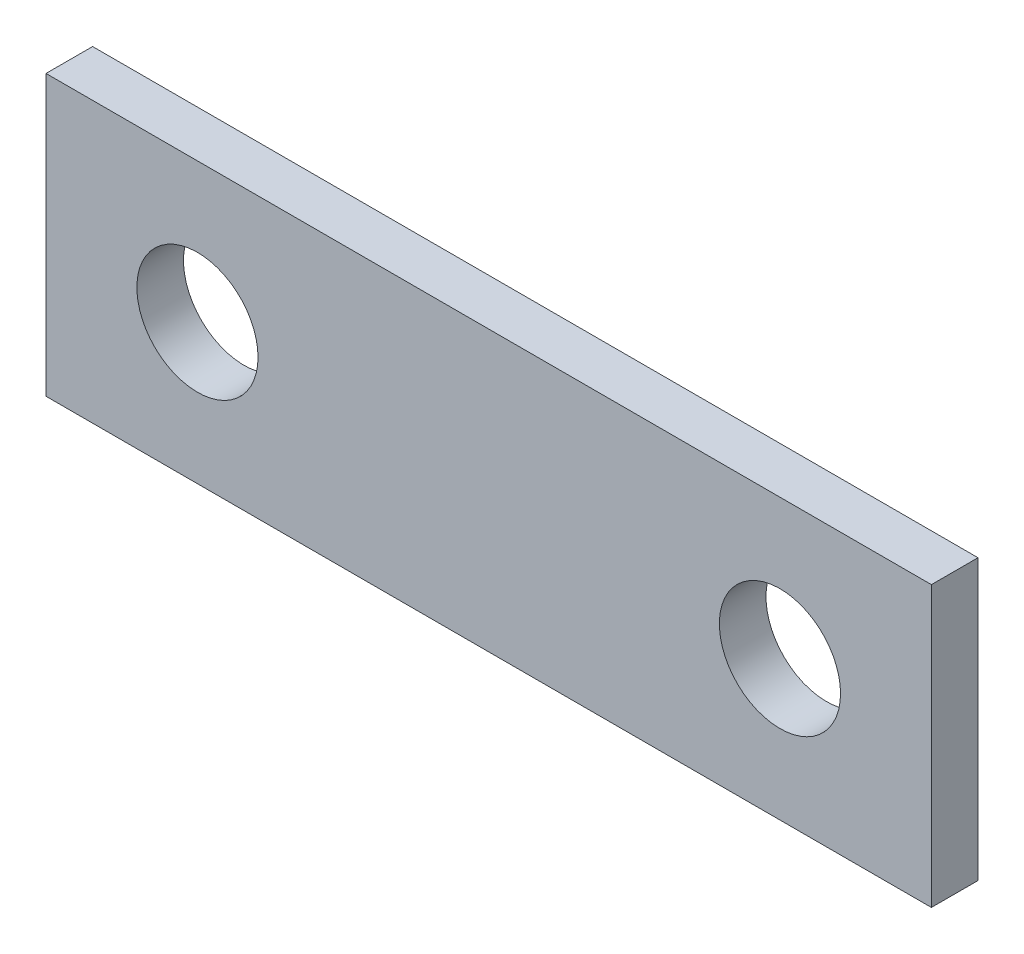
ISO-10303-21;
HEADER;
FILE_DESCRIPTION(('STEP AP214'),'2;1');
FILE_NAME('part.step','',(''),(''),'','','');
FILE_SCHEMA(('AUTOMOTIVE_DESIGN { 1 0 10303 214 1 1 1 1 }'));
ENDSEC;
DATA;
#1=APPLICATION_CONTEXT('core data for automotive mechanical design processes');
#2=APPLICATION_PROTOCOL_DEFINITION('international standard','automotive_design',2000,#1);
#3=PRODUCT_CONTEXT('',#1,'mechanical');
#4=PRODUCT('Part','Part','',(#3));
#5=PRODUCT_RELATED_PRODUCT_CATEGORY('part','',(#4));
#6=PRODUCT_DEFINITION_FORMATION('','',#4);
#7=PRODUCT_DEFINITION_CONTEXT('part definition',#1,'design');
#8=PRODUCT_DEFINITION('design','',#6,#7);
#9=PRODUCT_DEFINITION_SHAPE('','',#8);
#10=(LENGTH_UNIT() NAMED_UNIT(*) SI_UNIT(.MILLI.,.METRE.));
#11=(NAMED_UNIT(*) PLANE_ANGLE_UNIT() SI_UNIT($,.RADIAN.));
#12=(NAMED_UNIT(*) SI_UNIT($,.STERADIAN.) SOLID_ANGLE_UNIT());
#13=UNCERTAINTY_MEASURE_WITH_UNIT(LENGTH_MEASURE(1.E-05),#10,'distance_accuracy_value','');
#14=(GEOMETRIC_REPRESENTATION_CONTEXT(3) GLOBAL_UNCERTAINTY_ASSIGNED_CONTEXT((#13)) GLOBAL_UNIT_ASSIGNED_CONTEXT((#10,
#11,#12)) REPRESENTATION_CONTEXT('',''));
#15=CARTESIAN_POINT('',(0.,0.,0.));
#16=DIRECTION('',(0.,0.,1.));
#17=DIRECTION('',(1.,0.,0.));
#18=AXIS2_PLACEMENT_3D('',#15,#16,#17);
#19=CARTESIAN_POINT('',(0.,0.,2.));
#20=DIRECTION('',(0.,0.,-1.));
#21=DIRECTION('',(-1.,0.,0.));
#22=AXIS2_PLACEMENT_3D('',#19,#20,#21);
#23=PLANE('',#22);
#24=DIRECTION('',(0.,1.,0.));
#25=VECTOR('',#24,1.);
#26=CARTESIAN_POINT('',(19.,-5.99999999999999,2.));
#27=LINE('',#26,#25);
#28=CARTESIAN_POINT('',(19.,-5.99999999999999,2.));
#29=VERTEX_POINT('',#28);
#30=CARTESIAN_POINT('',(19.,6.00000000000001,2.));
#31=VERTEX_POINT('',#30);
#32=EDGE_CURVE('E85',#29,#31,#27,.T.);
#33=ORIENTED_EDGE('',*,*,#32,.T.);
#34=DIRECTION('',(-1.,0.,0.));
#35=VECTOR('',#34,1.);
#36=CARTESIAN_POINT('',(-19.,6.00000000000001,2.));
#37=LINE('',#36,#35);
#38=CARTESIAN_POINT('',(-19.,6.00000000000001,2.));
#39=VERTEX_POINT('',#38);
#40=EDGE_CURVE('E80',#31,#39,#37,.T.);
#41=ORIENTED_EDGE('',*,*,#40,.T.);
#42=DIRECTION('',(0.,-1.,0.));
#43=VECTOR('',#42,1.);
#44=CARTESIAN_POINT('',(-19.,-5.99999999999999,2.));
#45=LINE('',#44,#43);
#46=CARTESIAN_POINT('',(-19.,-5.99999999999999,2.));
#47=VERTEX_POINT('',#46);
#48=EDGE_CURVE('E83',#39,#47,#45,.T.);
#49=ORIENTED_EDGE('',*,*,#48,.T.);
#50=DIRECTION('',(1.,0.,0.));
#51=VECTOR('',#50,1.);
#52=CARTESIAN_POINT('',(-19.,-5.99999999999999,2.));
#53=LINE('',#52,#51);
#54=EDGE_CURVE('E50',#47,#29,#53,.T.);
#55=ORIENTED_EDGE('',*,*,#54,.T.);
#56=EDGE_LOOP('',(#33,#41,#49,#55));
#57=FACE_BOUND('',#56,.T.);
#58=CARTESIAN_POINT('',(12.5,0.,2.));
#59=DIRECTION('',(0.,0.,1.));
#60=DIRECTION('',(1.,0.,0.));
#61=AXIS2_PLACEMENT_3D('',#58,#59,#60);
#62=CIRCLE('',#61,2.6);
#63=CARTESIAN_POINT('',(15.1,0.,2.));
#64=VERTEX_POINT('',#63);
#65=EDGE_CURVE('E100',#64,#64,#62,.T.);
#66=ORIENTED_EDGE('',*,*,#65,.F.);
#67=EDGE_LOOP('',(#66));
#68=FACE_BOUND('',#67,.T.);
#69=CARTESIAN_POINT('',(-12.5,0.,2.));
#70=DIRECTION('',(0.,0.,1.));
#71=DIRECTION('',(1.,0.,0.));
#72=AXIS2_PLACEMENT_3D('',#69,#70,#71);
#73=CIRCLE('',#72,2.6);
#74=CARTESIAN_POINT('',(-9.89999999999998,0.,2.));
#75=VERTEX_POINT('',#74);
#76=EDGE_CURVE('E115',#75,#75,#73,.T.);
#77=ORIENTED_EDGE('',*,*,#76,.F.);
#78=EDGE_LOOP('',(#77));
#79=FACE_BOUND('',#78,.T.);
#80=ADVANCED_FACE('F33',(#57,#68,#79),#23,.F.);
#81=CARTESIAN_POINT('',(0.,0.,0.));
#82=DIRECTION('',(0.,0.,-1.));
#83=DIRECTION('',(-1.,0.,0.));
#84=AXIS2_PLACEMENT_3D('',#81,#82,#83);
#85=PLANE('',#84);
#86=CARTESIAN_POINT('',(12.5,0.,0.));
#87=DIRECTION('',(0.,0.,1.));
#88=DIRECTION('',(1.,0.,0.));
#89=AXIS2_PLACEMENT_3D('',#86,#87,#88);
#90=CIRCLE('',#89,2.6);
#91=CARTESIAN_POINT('',(15.1,0.,0.));
#92=VERTEX_POINT('',#91);
#93=EDGE_CURVE('E112',#92,#92,#90,.T.);
#94=ORIENTED_EDGE('',*,*,#93,.T.);
#95=EDGE_LOOP('',(#94));
#96=FACE_BOUND('',#95,.T.);
#97=DIRECTION('',(0.,1.,0.));
#98=VECTOR('',#97,1.);
#99=CARTESIAN_POINT('',(19.,-5.99999999999999,0.));
#100=LINE('',#99,#98);
#101=CARTESIAN_POINT('',(19.,-5.99999999999999,0.));
#102=VERTEX_POINT('',#101);
#103=CARTESIAN_POINT('',(19.,6.00000000000001,0.));
#104=VERTEX_POINT('',#103);
#105=EDGE_CURVE('E97',#102,#104,#100,.T.);
#106=ORIENTED_EDGE('',*,*,#105,.F.);
#107=DIRECTION('',(1.,0.,0.));
#108=VECTOR('',#107,1.);
#109=CARTESIAN_POINT('',(-19.,-5.99999999999999,0.));
#110=LINE('',#109,#108);
#111=CARTESIAN_POINT('',(-19.,-5.99999999999999,0.));
#112=VERTEX_POINT('',#111);
#113=EDGE_CURVE('E73',#112,#102,#110,.T.);
#114=ORIENTED_EDGE('',*,*,#113,.F.);
#115=DIRECTION('',(0.,-1.,0.));
#116=VECTOR('',#115,1.);
#117=CARTESIAN_POINT('',(-19.,-5.99999999999999,0.));
#118=LINE('',#117,#116);
#119=CARTESIAN_POINT('',(-19.,6.00000000000001,0.));
#120=VERTEX_POINT('',#119);
#121=EDGE_CURVE('E67',#120,#112,#118,.T.);
#122=ORIENTED_EDGE('',*,*,#121,.F.);
#123=DIRECTION('',(-1.,0.,0.));
#124=VECTOR('',#123,1.);
#125=CARTESIAN_POINT('',(-19.,6.00000000000001,0.));
#126=LINE('',#125,#124);
#127=EDGE_CURVE('E89',#104,#120,#126,.T.);
#128=ORIENTED_EDGE('',*,*,#127,.F.);
#129=EDGE_LOOP('',(#106,#114,#122,#128));
#130=FACE_BOUND('',#129,.T.);
#131=CARTESIAN_POINT('',(-12.5,0.,0.));
#132=DIRECTION('',(0.,0.,1.));
#133=DIRECTION('',(1.,0.,0.));
#134=AXIS2_PLACEMENT_3D('',#131,#132,#133);
#135=CIRCLE('',#134,2.6);
#136=CARTESIAN_POINT('',(-9.89999999999998,0.,0.));
#137=VERTEX_POINT('',#136);
#138=EDGE_CURVE('E118',#137,#137,#135,.T.);
#139=ORIENTED_EDGE('',*,*,#138,.T.);
#140=EDGE_LOOP('',(#139));
#141=FACE_BOUND('',#140,.T.);
#142=ADVANCED_FACE('F108',(#96,#130,#141),#85,.T.);
#143=CARTESIAN_POINT('',(19.,-5.99999999999999,2.));
#144=DIRECTION('',(-1.,0.,0.));
#145=DIRECTION('',(0.,0.,1.));
#146=AXIS2_PLACEMENT_3D('',#143,#144,#145);
#147=PLANE('',#146);
#148=ORIENTED_EDGE('',*,*,#105,.T.);
#149=DIRECTION('',(0.,0.,-1.));
#150=VECTOR('',#149,1.);
#151=CARTESIAN_POINT('',(19.,6.00000000000001,2.));
#152=LINE('',#151,#150);
#153=EDGE_CURVE('E11',#31,#104,#152,.T.);
#154=ORIENTED_EDGE('',*,*,#153,.F.);
#155=ORIENTED_EDGE('',*,*,#32,.F.);
#156=DIRECTION('',(0.,0.,-1.));
#157=VECTOR('',#156,1.);
#158=CARTESIAN_POINT('',(19.,-5.99999999999999,2.));
#159=LINE('',#158,#157);
#160=EDGE_CURVE('E93',#29,#102,#159,.T.);
#161=ORIENTED_EDGE('',*,*,#160,.T.);
#162=EDGE_LOOP('',(#148,#154,#155,#161));
#163=FACE_BOUND('',#162,.T.);
#164=ADVANCED_FACE('F35',(#163),#147,.F.);
#165=CARTESIAN_POINT('',(-19.,6.00000000000001,2.));
#166=DIRECTION('',(0.,-1.,0.));
#167=DIRECTION('',(0.,0.,-1.));
#168=AXIS2_PLACEMENT_3D('',#165,#166,#167);
#169=PLANE('',#168);
#170=ORIENTED_EDGE('',*,*,#127,.T.);
#171=DIRECTION('',(0.,0.,-1.));
#172=VECTOR('',#171,1.);
#173=CARTESIAN_POINT('',(-19.,6.00000000000001,2.));
#174=LINE('',#173,#172);
#175=EDGE_CURVE('E42',#39,#120,#174,.T.);
#176=ORIENTED_EDGE('',*,*,#175,.F.);
#177=ORIENTED_EDGE('',*,*,#40,.F.);
#178=ORIENTED_EDGE('',*,*,#153,.T.);
#179=EDGE_LOOP('',(#170,#176,#177,#178));
#180=FACE_BOUND('',#179,.T.);
#181=ADVANCED_FACE('F88',(#180),#169,.F.);
#182=CARTESIAN_POINT('',(-19.,-5.99999999999999,2.));
#183=DIRECTION('',(1.,0.,0.));
#184=DIRECTION('',(0.,0.,-1.));
#185=AXIS2_PLACEMENT_3D('',#182,#183,#184);
#186=PLANE('',#185);
#187=ORIENTED_EDGE('',*,*,#121,.T.);
#188=DIRECTION('',(0.,0.,-1.));
#189=VECTOR('',#188,1.);
#190=CARTESIAN_POINT('',(-19.,-5.99999999999999,2.));
#191=LINE('',#190,#189);
#192=EDGE_CURVE('E90',#47,#112,#191,.T.);
#193=ORIENTED_EDGE('',*,*,#192,.F.);
#194=ORIENTED_EDGE('',*,*,#48,.F.);
#195=ORIENTED_EDGE('',*,*,#175,.T.);
#196=EDGE_LOOP('',(#187,#193,#194,#195));
#197=FACE_BOUND('',#196,.T.);
#198=ADVANCED_FACE('F91',(#197),#186,.F.);
#199=CARTESIAN_POINT('',(-19.,-5.99999999999999,2.));
#200=DIRECTION('',(0.,1.,0.));
#201=DIRECTION('',(0.,0.,1.));
#202=AXIS2_PLACEMENT_3D('',#199,#200,#201);
#203=PLANE('',#202);
#204=ORIENTED_EDGE('',*,*,#113,.T.);
#205=ORIENTED_EDGE('',*,*,#160,.F.);
#206=ORIENTED_EDGE('',*,*,#54,.F.);
#207=ORIENTED_EDGE('',*,*,#192,.T.);
#208=EDGE_LOOP('',(#204,#205,#206,#207));
#209=FACE_BOUND('',#208,.T.);
#210=ADVANCED_FACE('F105',(#209),#203,.F.);
#211=CARTESIAN_POINT('',(12.5,0.,2.));
#212=DIRECTION('',(0.,0.,-1.));
#213=DIRECTION('',(-1.,0.,0.));
#214=AXIS2_PLACEMENT_3D('',#211,#212,#213);
#215=CYLINDRICAL_SURFACE('',#214,2.6);
#216=ORIENTED_EDGE('',*,*,#65,.T.);
#217=EDGE_LOOP('',(#216));
#218=FACE_BOUND('',#217,.T.);
#219=ORIENTED_EDGE('',*,*,#93,.F.);
#220=EDGE_LOOP('',(#219));
#221=FACE_BOUND('',#220,.T.);
#222=ADVANCED_FACE('F135',(#218,#221),#215,.F.);
#223=CARTESIAN_POINT('',(-12.5,0.,2.));
#224=DIRECTION('',(0.,0.,-1.));
#225=DIRECTION('',(-1.,0.,0.));
#226=AXIS2_PLACEMENT_3D('',#223,#224,#225);
#227=CYLINDRICAL_SURFACE('',#226,2.6);
#228=ORIENTED_EDGE('',*,*,#76,.T.);
#229=EDGE_LOOP('',(#228));
#230=FACE_BOUND('',#229,.T.);
#231=ORIENTED_EDGE('',*,*,#138,.F.);
#232=EDGE_LOOP('',(#231));
#233=FACE_BOUND('',#232,.T.);
#234=ADVANCED_FACE('F124',(#230,#233),#227,.F.);
#235=CLOSED_SHELL('',(#80,#142,#164,#181,#198,#210,#222,#234));
#236=MANIFOLD_SOLID_BREP('B2',#235);
#237=ADVANCED_BREP_SHAPE_REPRESENTATION('',(#18,#236),#14);
#238=SHAPE_DEFINITION_REPRESENTATION(#9,#237);
ENDSEC;
END-ISO-10303-21;
